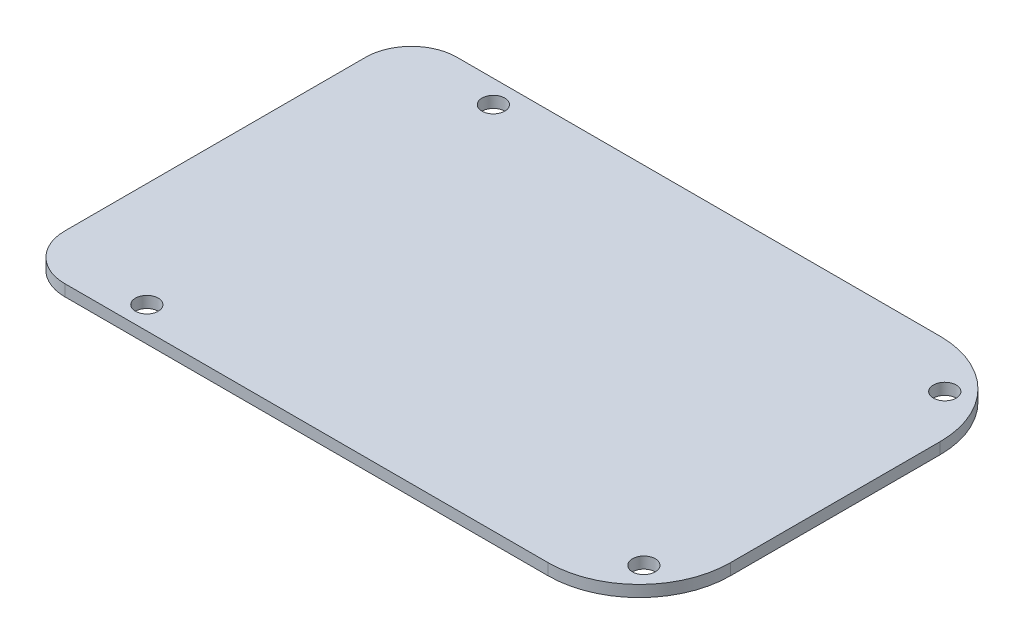
ISO-10303-21;
HEADER;
FILE_DESCRIPTION(('STEP AP214'),'2;1');
FILE_NAME('part.step','',(''),(''),'','','');
FILE_SCHEMA(('AUTOMOTIVE_DESIGN { 1 0 10303 214 1 1 1 1 }'));
ENDSEC;
DATA;
#1=APPLICATION_CONTEXT('core data for automotive mechanical design processes');
#2=APPLICATION_PROTOCOL_DEFINITION('international standard','automotive_design',2000,#1);
#3=PRODUCT_CONTEXT('',#1,'mechanical');
#4=PRODUCT('Part','Part','',(#3));
#5=PRODUCT_RELATED_PRODUCT_CATEGORY('part','',(#4));
#6=PRODUCT_DEFINITION_FORMATION('','',#4);
#7=PRODUCT_DEFINITION_CONTEXT('part definition',#1,'design');
#8=PRODUCT_DEFINITION('design','',#6,#7);
#9=PRODUCT_DEFINITION_SHAPE('','',#8);
#10=(LENGTH_UNIT() NAMED_UNIT(*) SI_UNIT(.MILLI.,.METRE.));
#11=(NAMED_UNIT(*) PLANE_ANGLE_UNIT() SI_UNIT($,.RADIAN.));
#12=(NAMED_UNIT(*) SI_UNIT($,.STERADIAN.) SOLID_ANGLE_UNIT());
#13=UNCERTAINTY_MEASURE_WITH_UNIT(LENGTH_MEASURE(1.E-05),#10,'distance_accuracy_value','');
#14=(GEOMETRIC_REPRESENTATION_CONTEXT(3) GLOBAL_UNCERTAINTY_ASSIGNED_CONTEXT((#13)) GLOBAL_UNIT_ASSIGNED_CONTEXT((#10,
#11,#12)) REPRESENTATION_CONTEXT('',''));
#15=CARTESIAN_POINT('',(0.,0.,0.));
#16=DIRECTION('',(0.,0.,1.));
#17=DIRECTION('',(1.,0.,0.));
#18=AXIS2_PLACEMENT_3D('',#15,#16,#17);
#19=CARTESIAN_POINT('',(-36.83,1.5875,20.955));
#20=DIRECTION('',(0.,-1.,0.));
#21=DIRECTION('',(0.,0.,-1.));
#22=AXIS2_PLACEMENT_3D('',#19,#20,#21);
#23=PLANE('',#22);
#24=CARTESIAN_POINT('',(-36.83,1.5875,20.955));
#25=DIRECTION('',(0.,1.,0.));
#26=DIRECTION('',(0.,0.,-1.));
#27=AXIS2_PLACEMENT_3D('',#24,#25,#26);
#28=CIRCLE('',#27,6.35);
#29=CARTESIAN_POINT('',(-43.18,1.5875,20.955));
#30=VERTEX_POINT('',#29);
#31=CARTESIAN_POINT('',(-36.83,1.5875,27.305));
#32=VERTEX_POINT('',#31);
#33=EDGE_CURVE('E146',#30,#32,#28,.T.);
#34=ORIENTED_EDGE('',*,*,#33,.T.);
#35=DIRECTION('',(1.,0.,0.));
#36=VECTOR('',#35,1.);
#37=CARTESIAN_POINT('',(-36.83,1.5875,27.305));
#38=LINE('',#37,#36);
#39=CARTESIAN_POINT('',(30.4799999999999,1.5875,27.305));
#40=VERTEX_POINT('',#39);
#41=EDGE_CURVE('E94',#32,#40,#38,.T.);
#42=ORIENTED_EDGE('',*,*,#41,.T.);
#43=CARTESIAN_POINT('',(30.48,1.5875,14.605));
#44=DIRECTION('',(0.,1.,0.));
#45=DIRECTION('',(0.,0.,1.));
#46=AXIS2_PLACEMENT_3D('',#43,#44,#45);
#47=CIRCLE('',#46,12.7);
#48=CARTESIAN_POINT('',(43.18,1.5875,14.6049999999999));
#49=VERTEX_POINT('',#48);
#50=EDGE_CURVE('E161',#40,#49,#47,.T.);
#51=ORIENTED_EDGE('',*,*,#50,.T.);
#52=DIRECTION('',(0.,0.,-1.));
#53=VECTOR('',#52,1.);
#54=CARTESIAN_POINT('',(43.18,1.5875,-14.6049999999999));
#55=LINE('',#54,#53);
#56=CARTESIAN_POINT('',(43.18,1.5875,-14.6049999999999));
#57=VERTEX_POINT('',#56);
#58=EDGE_CURVE('E174',#49,#57,#55,.T.);
#59=ORIENTED_EDGE('',*,*,#58,.T.);
#60=CARTESIAN_POINT('',(30.48,1.5875,-14.605));
#61=DIRECTION('',(0.,1.,0.));
#62=DIRECTION('',(0.,0.,1.));
#63=AXIS2_PLACEMENT_3D('',#60,#61,#62);
#64=CIRCLE('',#63,12.7);
#65=CARTESIAN_POINT('',(30.4799999999999,1.5875,-27.305));
#66=VERTEX_POINT('',#65);
#67=EDGE_CURVE('E113',#57,#66,#64,.T.);
#68=ORIENTED_EDGE('',*,*,#67,.T.);
#69=DIRECTION('',(-1.,0.,0.));
#70=VECTOR('',#69,1.);
#71=CARTESIAN_POINT('',(-36.83,1.5875,-27.305));
#72=LINE('',#71,#70);
#73=CARTESIAN_POINT('',(-36.83,1.5875,-27.305));
#74=VERTEX_POINT('',#73);
#75=EDGE_CURVE('E107',#66,#74,#72,.T.);
#76=ORIENTED_EDGE('',*,*,#75,.T.);
#77=CARTESIAN_POINT('',(-36.83,1.5875,-20.955));
#78=DIRECTION('',(0.,1.,0.));
#79=DIRECTION('',(0.,0.,-1.));
#80=AXIS2_PLACEMENT_3D('',#77,#78,#79);
#81=CIRCLE('',#80,6.35);
#82=CARTESIAN_POINT('',(-43.18,1.5875,-20.955));
#83=VERTEX_POINT('',#82);
#84=EDGE_CURVE('E111',#74,#83,#81,.T.);
#85=ORIENTED_EDGE('',*,*,#84,.T.);
#86=DIRECTION('',(0.,0.,1.));
#87=VECTOR('',#86,1.);
#88=CARTESIAN_POINT('',(-43.18,1.5875,-20.955));
#89=LINE('',#88,#87);
#90=EDGE_CURVE('E51',#83,#30,#89,.T.);
#91=ORIENTED_EDGE('',*,*,#90,.T.);
#92=EDGE_LOOP('',(#34,#42,#51,#59,#68,#76,#85,#91));
#93=FACE_BOUND('',#92,.T.);
#94=CARTESIAN_POINT('',(-28.575,1.5875,-24.13));
#95=DIRECTION('',(0.,1.,0.));
#96=DIRECTION('',(0.,0.,1.));
#97=AXIS2_PLACEMENT_3D('',#94,#95,#96);
#98=CIRCLE('',#97,1.5875);
#99=CARTESIAN_POINT('',(-28.575,1.5875,-22.5425));
#100=VERTEX_POINT('',#99);
#101=EDGE_CURVE('E135',#100,#100,#98,.T.);
#102=ORIENTED_EDGE('',*,*,#101,.F.);
#103=EDGE_LOOP('',(#102));
#104=FACE_BOUND('',#103,.T.);
#105=CARTESIAN_POINT('',(-28.575,1.5875,24.13));
#106=DIRECTION('',(0.,1.,0.));
#107=DIRECTION('',(0.,0.,1.));
#108=AXIS2_PLACEMENT_3D('',#105,#106,#107);
#109=CIRCLE('',#108,1.5875);
#110=CARTESIAN_POINT('',(-28.575,1.5875,25.7175));
#111=VERTEX_POINT('',#110);
#112=EDGE_CURVE('E183',#111,#111,#109,.T.);
#113=ORIENTED_EDGE('',*,*,#112,.F.);
#114=EDGE_LOOP('',(#113));
#115=FACE_BOUND('',#114,.T.);
#116=CARTESIAN_POINT('',(37.465,1.5875,20.955));
#117=DIRECTION('',(0.,1.,0.));
#118=DIRECTION('',(0.,0.,1.));
#119=AXIS2_PLACEMENT_3D('',#116,#117,#118);
#120=CIRCLE('',#119,1.5875);
#121=CARTESIAN_POINT('',(37.465,1.5875,22.5425));
#122=VERTEX_POINT('',#121);
#123=EDGE_CURVE('E189',#122,#122,#120,.T.);
#124=ORIENTED_EDGE('',*,*,#123,.F.);
#125=EDGE_LOOP('',(#124));
#126=FACE_BOUND('',#125,.T.);
#127=CARTESIAN_POINT('',(37.465,1.5875,-20.955));
#128=DIRECTION('',(0.,1.,0.));
#129=DIRECTION('',(0.,0.,1.));
#130=AXIS2_PLACEMENT_3D('',#127,#128,#129);
#131=CIRCLE('',#130,1.5875);
#132=CARTESIAN_POINT('',(37.465,1.5875,-19.3675));
#133=VERTEX_POINT('',#132);
#134=EDGE_CURVE('E195',#133,#133,#131,.T.);
#135=ORIENTED_EDGE('',*,*,#134,.F.);
#136=EDGE_LOOP('',(#135));
#137=FACE_BOUND('',#136,.T.);
#138=ADVANCED_FACE('F34',(#93,#104,#115,#126,#137),#23,.F.);
#139=CARTESIAN_POINT('',(-36.83,0.,20.955));
#140=DIRECTION('',(0.,-1.,0.));
#141=DIRECTION('',(0.,0.,-1.));
#142=AXIS2_PLACEMENT_3D('',#139,#140,#141);
#143=PLANE('',#142);
#144=CARTESIAN_POINT('',(37.465,0.,20.955));
#145=DIRECTION('',(0.,1.,0.));
#146=DIRECTION('',(0.,0.,1.));
#147=AXIS2_PLACEMENT_3D('',#144,#145,#146);
#148=CIRCLE('',#147,1.5875);
#149=CARTESIAN_POINT('',(37.465,0.,22.5425));
#150=VERTEX_POINT('',#149);
#151=EDGE_CURVE('E192',#150,#150,#148,.T.);
#152=ORIENTED_EDGE('',*,*,#151,.T.);
#153=EDGE_LOOP('',(#152));
#154=FACE_BOUND('',#153,.T.);
#155=CARTESIAN_POINT('',(-28.575,0.,-24.13));
#156=DIRECTION('',(0.,1.,0.));
#157=DIRECTION('',(0.,0.,1.));
#158=AXIS2_PLACEMENT_3D('',#155,#156,#157);
#159=CIRCLE('',#158,1.5875);
#160=CARTESIAN_POINT('',(-28.575,0.,-22.5425));
#161=VERTEX_POINT('',#160);
#162=EDGE_CURVE('E180',#161,#161,#159,.T.);
#163=ORIENTED_EDGE('',*,*,#162,.T.);
#164=EDGE_LOOP('',(#163));
#165=FACE_BOUND('',#164,.T.);
#166=CARTESIAN_POINT('',(-36.83,0.,20.955));
#167=DIRECTION('',(0.,1.,0.));
#168=DIRECTION('',(0.,0.,-1.));
#169=AXIS2_PLACEMENT_3D('',#166,#167,#168);
#170=CIRCLE('',#169,6.35);
#171=CARTESIAN_POINT('',(-43.18,0.,20.955));
#172=VERTEX_POINT('',#171);
#173=CARTESIAN_POINT('',(-36.83,0.,27.305));
#174=VERTEX_POINT('',#173);
#175=EDGE_CURVE('E131',#172,#174,#170,.T.);
#176=ORIENTED_EDGE('',*,*,#175,.F.);
#177=DIRECTION('',(0.,0.,1.));
#178=VECTOR('',#177,1.);
#179=CARTESIAN_POINT('',(-43.18,0.,-20.955));
#180=LINE('',#179,#178);
#181=CARTESIAN_POINT('',(-43.18,0.,-20.955));
#182=VERTEX_POINT('',#181);
#183=EDGE_CURVE('E86',#182,#172,#180,.T.);
#184=ORIENTED_EDGE('',*,*,#183,.F.);
#185=CARTESIAN_POINT('',(-36.83,0.,-20.955));
#186=DIRECTION('',(0.,1.,0.));
#187=DIRECTION('',(0.,0.,-1.));
#188=AXIS2_PLACEMENT_3D('',#185,#186,#187);
#189=CIRCLE('',#188,6.35);
#190=CARTESIAN_POINT('',(-36.83,0.,-27.305));
#191=VERTEX_POINT('',#190);
#192=EDGE_CURVE('E80',#191,#182,#189,.T.);
#193=ORIENTED_EDGE('',*,*,#192,.F.);
#194=DIRECTION('',(-1.,0.,0.));
#195=VECTOR('',#194,1.);
#196=CARTESIAN_POINT('',(-36.83,0.,-27.305));
#197=LINE('',#196,#195);
#198=CARTESIAN_POINT('',(30.4799999999999,0.,-27.305));
#199=VERTEX_POINT('',#198);
#200=EDGE_CURVE('E121',#199,#191,#197,.T.);
#201=ORIENTED_EDGE('',*,*,#200,.F.);
#202=CARTESIAN_POINT('',(30.48,0.,-14.605));
#203=DIRECTION('',(0.,1.,0.));
#204=DIRECTION('',(0.,0.,1.));
#205=AXIS2_PLACEMENT_3D('',#202,#203,#204);
#206=CIRCLE('',#205,12.7);
#207=CARTESIAN_POINT('',(43.18,0.,-14.6049999999999));
#208=VERTEX_POINT('',#207);
#209=EDGE_CURVE('E141',#208,#199,#206,.T.);
#210=ORIENTED_EDGE('',*,*,#209,.F.);
#211=DIRECTION('',(0.,0.,-1.));
#212=VECTOR('',#211,1.);
#213=CARTESIAN_POINT('',(43.18,0.,-14.6049999999999));
#214=LINE('',#213,#212);
#215=CARTESIAN_POINT('',(43.18,0.,14.6049999999999));
#216=VERTEX_POINT('',#215);
#217=EDGE_CURVE('E139',#216,#208,#214,.T.);
#218=ORIENTED_EDGE('',*,*,#217,.F.);
#219=CARTESIAN_POINT('',(30.48,0.,14.605));
#220=DIRECTION('',(0.,1.,0.));
#221=DIRECTION('',(0.,0.,1.));
#222=AXIS2_PLACEMENT_3D('',#219,#220,#221);
#223=CIRCLE('',#222,12.7);
#224=CARTESIAN_POINT('',(30.4799999999999,0.,27.305));
#225=VERTEX_POINT('',#224);
#226=EDGE_CURVE('E137',#225,#216,#223,.T.);
#227=ORIENTED_EDGE('',*,*,#226,.F.);
#228=DIRECTION('',(1.,0.,0.));
#229=VECTOR('',#228,1.);
#230=CARTESIAN_POINT('',(-36.83,0.,27.305));
#231=LINE('',#230,#229);
#232=EDGE_CURVE('E134',#174,#225,#231,.T.);
#233=ORIENTED_EDGE('',*,*,#232,.F.);
#234=EDGE_LOOP('',(#176,#184,#193,#201,#210,#218,#227,#233));
#235=FACE_BOUND('',#234,.T.);
#236=CARTESIAN_POINT('',(-28.575,0.,24.13));
#237=DIRECTION('',(0.,1.,0.));
#238=DIRECTION('',(0.,0.,1.));
#239=AXIS2_PLACEMENT_3D('',#236,#237,#238);
#240=CIRCLE('',#239,1.5875);
#241=CARTESIAN_POINT('',(-28.575,0.,25.7175));
#242=VERTEX_POINT('',#241);
#243=EDGE_CURVE('E186',#242,#242,#240,.T.);
#244=ORIENTED_EDGE('',*,*,#243,.T.);
#245=EDGE_LOOP('',(#244));
#246=FACE_BOUND('',#245,.T.);
#247=CARTESIAN_POINT('',(37.465,0.,-20.955));
#248=DIRECTION('',(0.,1.,0.));
#249=DIRECTION('',(0.,0.,1.));
#250=AXIS2_PLACEMENT_3D('',#247,#248,#249);
#251=CIRCLE('',#250,1.5875);
#252=CARTESIAN_POINT('',(37.465,0.,-19.3675));
#253=VERTEX_POINT('',#252);
#254=EDGE_CURVE('E198',#253,#253,#251,.T.);
#255=ORIENTED_EDGE('',*,*,#254,.T.);
#256=EDGE_LOOP('',(#255));
#257=FACE_BOUND('',#256,.T.);
#258=ADVANCED_FACE('F165',(#154,#165,#235,#246,#257),#143,.T.);
#259=CARTESIAN_POINT('',(-36.83,1.5875,20.955));
#260=DIRECTION('',(0.,-1.,0.));
#261=DIRECTION('',(0.,0.,-1.));
#262=AXIS2_PLACEMENT_3D('',#259,#260,#261);
#263=CYLINDRICAL_SURFACE('',#262,6.35);
#264=ORIENTED_EDGE('',*,*,#175,.T.);
#265=DIRECTION('',(0.,-1.,0.));
#266=VECTOR('',#265,1.);
#267=CARTESIAN_POINT('',(-36.83,1.5875,27.305));
#268=LINE('',#267,#266);
#269=EDGE_CURVE('E11',#32,#174,#268,.T.);
#270=ORIENTED_EDGE('',*,*,#269,.F.);
#271=ORIENTED_EDGE('',*,*,#33,.F.);
#272=DIRECTION('',(0.,-1.,0.));
#273=VECTOR('',#272,1.);
#274=CARTESIAN_POINT('',(-43.18,1.5875,20.955));
#275=LINE('',#274,#273);
#276=EDGE_CURVE('E127',#30,#172,#275,.T.);
#277=ORIENTED_EDGE('',*,*,#276,.T.);
#278=EDGE_LOOP('',(#264,#270,#271,#277));
#279=FACE_BOUND('',#278,.T.);
#280=ADVANCED_FACE('F36',(#279),#263,.T.);
#281=CARTESIAN_POINT('',(-36.83,1.5875,27.305));
#282=DIRECTION('',(0.,0.,-1.));
#283=DIRECTION('',(-1.,0.,0.));
#284=AXIS2_PLACEMENT_3D('',#281,#282,#283);
#285=PLANE('',#284);
#286=ORIENTED_EDGE('',*,*,#232,.T.);
#287=DIRECTION('',(0.,-1.,0.));
#288=VECTOR('',#287,1.);
#289=CARTESIAN_POINT('',(30.4799999999999,1.5875,27.305));
#290=LINE('',#289,#288);
#291=EDGE_CURVE('E43',#40,#225,#290,.T.);
#292=ORIENTED_EDGE('',*,*,#291,.F.);
#293=ORIENTED_EDGE('',*,*,#41,.F.);
#294=ORIENTED_EDGE('',*,*,#269,.T.);
#295=EDGE_LOOP('',(#286,#292,#293,#294));
#296=FACE_BOUND('',#295,.T.);
#297=ADVANCED_FACE('F230',(#296),#285,.F.);
#298=CARTESIAN_POINT('',(30.48,1.5875,14.605));
#299=DIRECTION('',(0.,-1.,0.));
#300=DIRECTION('',(0.,0.,-1.));
#301=AXIS2_PLACEMENT_3D('',#298,#299,#300);
#302=CYLINDRICAL_SURFACE('',#301,12.7);
#303=ORIENTED_EDGE('',*,*,#226,.T.);
#304=DIRECTION('',(0.,-1.,0.));
#305=VECTOR('',#304,1.);
#306=CARTESIAN_POINT('',(43.18,1.5875,14.6049999999999));
#307=LINE('',#306,#305);
#308=EDGE_CURVE('E153',#49,#216,#307,.T.);
#309=ORIENTED_EDGE('',*,*,#308,.F.);
#310=ORIENTED_EDGE('',*,*,#50,.F.);
#311=ORIENTED_EDGE('',*,*,#291,.T.);
#312=EDGE_LOOP('',(#303,#309,#310,#311));
#313=FACE_BOUND('',#312,.T.);
#314=ADVANCED_FACE('F159',(#313),#302,.T.);
#315=CARTESIAN_POINT('',(43.18,1.5875,-14.6049999999999));
#316=DIRECTION('',(-1.,0.,0.));
#317=DIRECTION('',(0.,0.,1.));
#318=AXIS2_PLACEMENT_3D('',#315,#316,#317);
#319=PLANE('',#318);
#320=ORIENTED_EDGE('',*,*,#217,.T.);
#321=DIRECTION('',(0.,-1.,0.));
#322=VECTOR('',#321,1.);
#323=CARTESIAN_POINT('',(43.18,1.5875,-14.6049999999999));
#324=LINE('',#323,#322);
#325=EDGE_CURVE('E150',#57,#208,#324,.T.);
#326=ORIENTED_EDGE('',*,*,#325,.F.);
#327=ORIENTED_EDGE('',*,*,#58,.F.);
#328=ORIENTED_EDGE('',*,*,#308,.T.);
#329=EDGE_LOOP('',(#320,#326,#327,#328));
#330=FACE_BOUND('',#329,.T.);
#331=ADVANCED_FACE('F170',(#330),#319,.F.);
#332=CARTESIAN_POINT('',(30.48,1.5875,-14.605));
#333=DIRECTION('',(0.,-1.,0.));
#334=DIRECTION('',(0.,0.,-1.));
#335=AXIS2_PLACEMENT_3D('',#332,#333,#334);
#336=CYLINDRICAL_SURFACE('',#335,12.7);
#337=ORIENTED_EDGE('',*,*,#209,.T.);
#338=DIRECTION('',(0.,-1.,0.));
#339=VECTOR('',#338,1.);
#340=CARTESIAN_POINT('',(30.4799999999999,1.5875,-27.305));
#341=LINE('',#340,#339);
#342=EDGE_CURVE('E122',#66,#199,#341,.T.);
#343=ORIENTED_EDGE('',*,*,#342,.F.);
#344=ORIENTED_EDGE('',*,*,#67,.F.);
#345=ORIENTED_EDGE('',*,*,#325,.T.);
#346=EDGE_LOOP('',(#337,#343,#344,#345));
#347=FACE_BOUND('',#346,.T.);
#348=ADVANCED_FACE('F173',(#347),#336,.T.);
#349=CARTESIAN_POINT('',(-36.83,1.5875,-27.305));
#350=DIRECTION('',(0.,0.,1.));
#351=DIRECTION('',(1.,0.,0.));
#352=AXIS2_PLACEMENT_3D('',#349,#350,#351);
#353=PLANE('',#352);
#354=ORIENTED_EDGE('',*,*,#200,.T.);
#355=DIRECTION('',(0.,-1.,0.));
#356=VECTOR('',#355,1.);
#357=CARTESIAN_POINT('',(-36.83,1.5875,-27.305));
#358=LINE('',#357,#356);
#359=EDGE_CURVE('E118',#74,#191,#358,.T.);
#360=ORIENTED_EDGE('',*,*,#359,.F.);
#361=ORIENTED_EDGE('',*,*,#75,.F.);
#362=ORIENTED_EDGE('',*,*,#342,.T.);
#363=EDGE_LOOP('',(#354,#360,#361,#362));
#364=FACE_BOUND('',#363,.T.);
#365=ADVANCED_FACE('F119',(#364),#353,.F.);
#366=CARTESIAN_POINT('',(-36.83,1.5875,-20.955));
#367=DIRECTION('',(0.,-1.,0.));
#368=DIRECTION('',(0.,0.,-1.));
#369=AXIS2_PLACEMENT_3D('',#366,#367,#368);
#370=CYLINDRICAL_SURFACE('',#369,6.35);
#371=ORIENTED_EDGE('',*,*,#192,.T.);
#372=DIRECTION('',(0.,-1.,0.));
#373=VECTOR('',#372,1.);
#374=CARTESIAN_POINT('',(-43.18,1.5875,-20.955));
#375=LINE('',#374,#373);
#376=EDGE_CURVE('E123',#83,#182,#375,.T.);
#377=ORIENTED_EDGE('',*,*,#376,.F.);
#378=ORIENTED_EDGE('',*,*,#84,.F.);
#379=ORIENTED_EDGE('',*,*,#359,.T.);
#380=EDGE_LOOP('',(#371,#377,#378,#379));
#381=FACE_BOUND('',#380,.T.);
#382=ADVANCED_FACE('F125',(#381),#370,.T.);
#383=CARTESIAN_POINT('',(-43.18,1.5875,-20.955));
#384=DIRECTION('',(1.,0.,0.));
#385=DIRECTION('',(0.,0.,-1.));
#386=AXIS2_PLACEMENT_3D('',#383,#384,#385);
#387=PLANE('',#386);
#388=ORIENTED_EDGE('',*,*,#183,.T.);
#389=ORIENTED_EDGE('',*,*,#276,.F.);
#390=ORIENTED_EDGE('',*,*,#90,.F.);
#391=ORIENTED_EDGE('',*,*,#376,.T.);
#392=EDGE_LOOP('',(#388,#389,#390,#391));
#393=FACE_BOUND('',#392,.T.);
#394=ADVANCED_FACE('F218',(#393),#387,.F.);
#395=CARTESIAN_POINT('',(-28.575,1.5875,-24.13));
#396=DIRECTION('',(0.,-1.,0.));
#397=DIRECTION('',(0.,0.,-1.));
#398=AXIS2_PLACEMENT_3D('',#395,#396,#397);
#399=CYLINDRICAL_SURFACE('',#398,1.5875);
#400=ORIENTED_EDGE('',*,*,#101,.T.);
#401=EDGE_LOOP('',(#400));
#402=FACE_BOUND('',#401,.T.);
#403=ORIENTED_EDGE('',*,*,#162,.F.);
#404=EDGE_LOOP('',(#403));
#405=FACE_BOUND('',#404,.T.);
#406=ADVANCED_FACE('F215',(#402,#405),#399,.F.);
#407=CARTESIAN_POINT('',(-28.575,1.5875,24.13));
#408=DIRECTION('',(0.,-1.,0.));
#409=DIRECTION('',(0.,0.,-1.));
#410=AXIS2_PLACEMENT_3D('',#407,#408,#409);
#411=CYLINDRICAL_SURFACE('',#410,1.5875);
#412=ORIENTED_EDGE('',*,*,#112,.T.);
#413=EDGE_LOOP('',(#412));
#414=FACE_BOUND('',#413,.T.);
#415=ORIENTED_EDGE('',*,*,#243,.F.);
#416=EDGE_LOOP('',(#415));
#417=FACE_BOUND('',#416,.T.);
#418=ADVANCED_FACE('F294',(#414,#417),#411,.F.);
#419=CARTESIAN_POINT('',(37.465,1.5875,20.955));
#420=DIRECTION('',(0.,-1.,0.));
#421=DIRECTION('',(0.,0.,-1.));
#422=AXIS2_PLACEMENT_3D('',#419,#420,#421);
#423=CYLINDRICAL_SURFACE('',#422,1.5875);
#424=ORIENTED_EDGE('',*,*,#123,.T.);
#425=EDGE_LOOP('',(#424));
#426=FACE_BOUND('',#425,.T.);
#427=ORIENTED_EDGE('',*,*,#151,.F.);
#428=EDGE_LOOP('',(#427));
#429=FACE_BOUND('',#428,.T.);
#430=ADVANCED_FACE('F302',(#426,#429),#423,.F.);
#431=CARTESIAN_POINT('',(37.465,1.5875,-20.955));
#432=DIRECTION('',(0.,-1.,0.));
#433=DIRECTION('',(0.,0.,-1.));
#434=AXIS2_PLACEMENT_3D('',#431,#432,#433);
#435=CYLINDRICAL_SURFACE('',#434,1.5875);
#436=ORIENTED_EDGE('',*,*,#134,.T.);
#437=EDGE_LOOP('',(#436));
#438=FACE_BOUND('',#437,.T.);
#439=ORIENTED_EDGE('',*,*,#254,.F.);
#440=EDGE_LOOP('',(#439));
#441=FACE_BOUND('',#440,.T.);
#442=ADVANCED_FACE('F204',(#438,#441),#435,.F.);
#443=CLOSED_SHELL('',(#138,#258,#280,#297,#314,#331,#348,#365,#382,#394,#406,#418,#430,#442));
#444=MANIFOLD_SOLID_BREP('B2',#443);
#445=ADVANCED_BREP_SHAPE_REPRESENTATION('',(#18,#444),#14);
#446=SHAPE_DEFINITION_REPRESENTATION(#9,#445);
ENDSEC;
END-ISO-10303-21;
